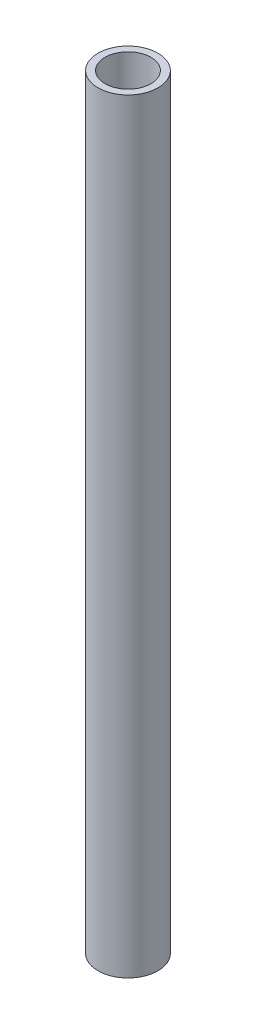
ISO-10303-21;
HEADER;
FILE_DESCRIPTION(('STEP AP214'),'2;1');
FILE_NAME('part.step','',(''),(''),'','','');
FILE_SCHEMA(('AUTOMOTIVE_DESIGN { 1 0 10303 214 1 1 1 1 }'));
ENDSEC;
DATA;
#1=APPLICATION_CONTEXT('core data for automotive mechanical design processes');
#2=APPLICATION_PROTOCOL_DEFINITION('international standard','automotive_design',2000,#1);
#3=PRODUCT_CONTEXT('',#1,'mechanical');
#4=PRODUCT('Part','Part','',(#3));
#5=PRODUCT_RELATED_PRODUCT_CATEGORY('part','',(#4));
#6=PRODUCT_DEFINITION_FORMATION('','',#4);
#7=PRODUCT_DEFINITION_CONTEXT('part definition',#1,'design');
#8=PRODUCT_DEFINITION('design','',#6,#7);
#9=PRODUCT_DEFINITION_SHAPE('','',#8);
#10=(LENGTH_UNIT() NAMED_UNIT(*) SI_UNIT(.MILLI.,.METRE.));
#11=(NAMED_UNIT(*) PLANE_ANGLE_UNIT() SI_UNIT($,.RADIAN.));
#12=(NAMED_UNIT(*) SI_UNIT($,.STERADIAN.) SOLID_ANGLE_UNIT());
#13=UNCERTAINTY_MEASURE_WITH_UNIT(LENGTH_MEASURE(1.E-05),#10,'distance_accuracy_value','');
#14=(GEOMETRIC_REPRESENTATION_CONTEXT(3) GLOBAL_UNCERTAINTY_ASSIGNED_CONTEXT((#13)) GLOBAL_UNIT_ASSIGNED_CONTEXT((#10,
#11,#12)) REPRESENTATION_CONTEXT('',''));
#15=CARTESIAN_POINT('',(0.,0.,0.));
#16=DIRECTION('',(0.,0.,1.));
#17=DIRECTION('',(1.,0.,0.));
#18=AXIS2_PLACEMENT_3D('',#15,#16,#17);
#19=CARTESIAN_POINT('',(0.,-16.51,0.));
#20=DIRECTION('',(0.,1.,0.));
#21=DIRECTION('',(0.,0.,1.));
#22=AXIS2_PLACEMENT_3D('',#19,#20,#21);
#23=CYLINDRICAL_SURFACE('',#22,0.6477);
#24=CARTESIAN_POINT('',(0.,-16.51,0.));
#25=DIRECTION('',(0.,1.,0.));
#26=DIRECTION('',(0.,0.,1.));
#27=AXIS2_PLACEMENT_3D('',#24,#25,#26);
#28=CIRCLE('',#27,0.6477);
#29=CARTESIAN_POINT('',(0.,-16.51,0.6477));
#30=VERTEX_POINT('',#29);
#31=EDGE_CURVE('E10',#30,#30,#28,.T.);
#32=ORIENTED_EDGE('',*,*,#31,.T.);
#33=EDGE_LOOP('',(#32));
#34=FACE_BOUND('',#33,.T.);
#35=CARTESIAN_POINT('',(0.,0.,0.));
#36=DIRECTION('',(0.,1.,0.));
#37=DIRECTION('',(0.,0.,1.));
#38=AXIS2_PLACEMENT_3D('',#35,#36,#37);
#39=CIRCLE('',#38,0.6477);
#40=CARTESIAN_POINT('',(0.,0.,0.6477));
#41=VERTEX_POINT('',#40);
#42=EDGE_CURVE('E37',#41,#41,#39,.T.);
#43=ORIENTED_EDGE('',*,*,#42,.F.);
#44=EDGE_LOOP('',(#43));
#45=FACE_BOUND('',#44,.T.);
#46=ADVANCED_FACE('F34',(#34,#45),#23,.T.);
#47=CARTESIAN_POINT('',(0.,-16.51,0.));
#48=DIRECTION('',(0.,1.,0.));
#49=DIRECTION('',(0.,0.,1.));
#50=AXIS2_PLACEMENT_3D('',#47,#48,#49);
#51=PLANE('',#50);
#52=CARTESIAN_POINT('',(0.,-16.51,0.));
#53=DIRECTION('',(0.,1.,0.));
#54=DIRECTION('',(0.,0.,1.));
#55=AXIS2_PLACEMENT_3D('',#52,#53,#54);
#56=CIRCLE('',#55,0.4953);
#57=CARTESIAN_POINT('',(0.,-16.51,0.4953));
#58=VERTEX_POINT('',#57);
#59=EDGE_CURVE('E44',#58,#58,#56,.T.);
#60=ORIENTED_EDGE('',*,*,#59,.T.);
#61=EDGE_LOOP('',(#60));
#62=FACE_BOUND('',#61,.T.);
#63=ORIENTED_EDGE('',*,*,#31,.F.);
#64=EDGE_LOOP('',(#63));
#65=FACE_BOUND('',#64,.T.);
#66=ADVANCED_FACE('F52',(#62,#65),#51,.F.);
#67=CARTESIAN_POINT('',(0.,0.,0.));
#68=DIRECTION('',(0.,1.,0.));
#69=DIRECTION('',(0.,0.,1.));
#70=AXIS2_PLACEMENT_3D('',#67,#68,#69);
#71=PLANE('',#70);
#72=CARTESIAN_POINT('',(0.,0.,0.));
#73=DIRECTION('',(0.,1.,0.));
#74=DIRECTION('',(0.,0.,1.));
#75=AXIS2_PLACEMENT_3D('',#72,#73,#74);
#76=CIRCLE('',#75,0.4953);
#77=CARTESIAN_POINT('',(0.,0.,0.4953));
#78=VERTEX_POINT('',#77);
#79=EDGE_CURVE('E46',#78,#78,#76,.T.);
#80=ORIENTED_EDGE('',*,*,#79,.F.);
#81=EDGE_LOOP('',(#80));
#82=FACE_BOUND('',#81,.T.);
#83=ORIENTED_EDGE('',*,*,#42,.T.);
#84=EDGE_LOOP('',(#83));
#85=FACE_BOUND('',#84,.T.);
#86=ADVANCED_FACE('F58',(#82,#85),#71,.T.);
#87=CARTESIAN_POINT('',(0.,-16.51,0.));
#88=DIRECTION('',(0.,1.,0.));
#89=DIRECTION('',(0.,0.,1.));
#90=AXIS2_PLACEMENT_3D('',#87,#88,#89);
#91=CYLINDRICAL_SURFACE('',#90,0.4953);
#92=ORIENTED_EDGE('',*,*,#59,.F.);
#93=EDGE_LOOP('',(#92));
#94=FACE_BOUND('',#93,.T.);
#95=ORIENTED_EDGE('',*,*,#79,.T.);
#96=EDGE_LOOP('',(#95));
#97=FACE_BOUND('',#96,.T.);
#98=ADVANCED_FACE('F55',(#94,#97),#91,.F.);
#99=CLOSED_SHELL('',(#46,#66,#86,#98));
#100=MANIFOLD_SOLID_BREP('B2',#99);
#101=ADVANCED_BREP_SHAPE_REPRESENTATION('',(#18,#100),#14);
#102=SHAPE_DEFINITION_REPRESENTATION(#9,#101);
ENDSEC;
END-ISO-10303-21;
